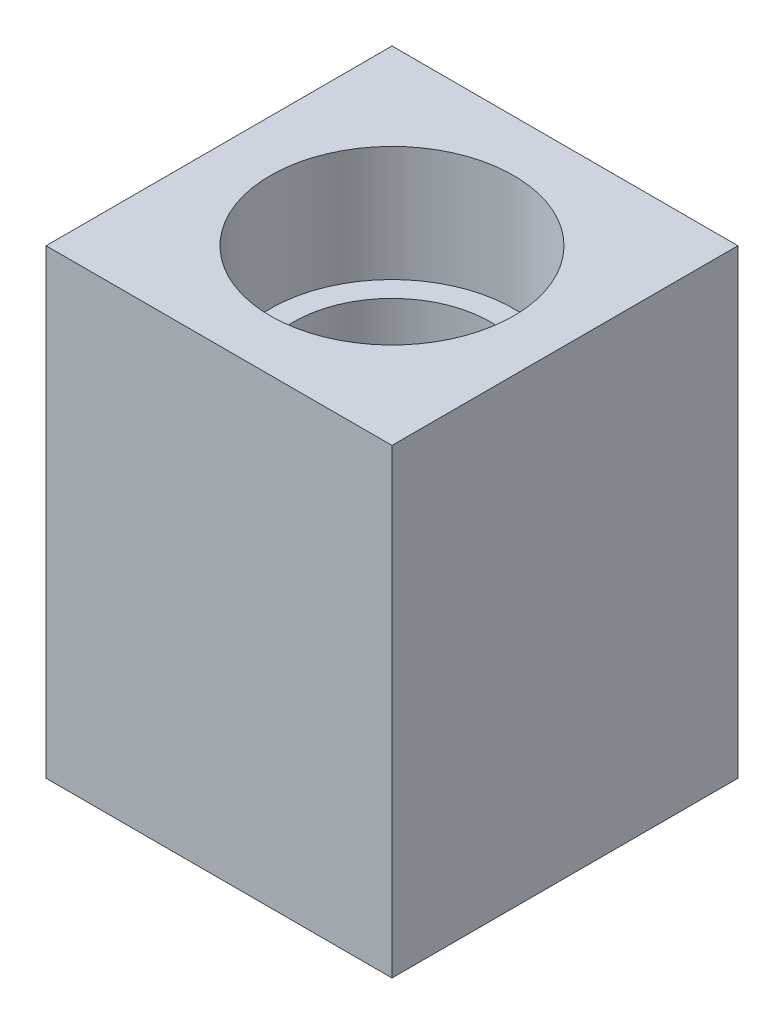
ISO-10303-21;
HEADER;
FILE_DESCRIPTION(('STEP AP214'),'2;1');
FILE_NAME('part.step','',(''),(''),'','','');
FILE_SCHEMA(('AUTOMOTIVE_DESIGN { 1 0 10303 214 1 1 1 1 }'));
ENDSEC;
DATA;
#1=APPLICATION_CONTEXT('core data for automotive mechanical design processes');
#2=APPLICATION_PROTOCOL_DEFINITION('international standard','automotive_design',2000,#1);
#3=PRODUCT_CONTEXT('',#1,'mechanical');
#4=PRODUCT('Part','Part','',(#3));
#5=PRODUCT_RELATED_PRODUCT_CATEGORY('part','',(#4));
#6=PRODUCT_DEFINITION_FORMATION('','',#4);
#7=PRODUCT_DEFINITION_CONTEXT('part definition',#1,'design');
#8=PRODUCT_DEFINITION('design','',#6,#7);
#9=PRODUCT_DEFINITION_SHAPE('','',#8);
#10=(LENGTH_UNIT() NAMED_UNIT(*) SI_UNIT(.MILLI.,.METRE.));
#11=(NAMED_UNIT(*) PLANE_ANGLE_UNIT() SI_UNIT($,.RADIAN.));
#12=(NAMED_UNIT(*) SI_UNIT($,.STERADIAN.) SOLID_ANGLE_UNIT());
#13=UNCERTAINTY_MEASURE_WITH_UNIT(LENGTH_MEASURE(1.E-05),#10,'distance_accuracy_value','');
#14=(GEOMETRIC_REPRESENTATION_CONTEXT(3) GLOBAL_UNCERTAINTY_ASSIGNED_CONTEXT((#13)) GLOBAL_UNIT_ASSIGNED_CONTEXT((#10,
#11,#12)) REPRESENTATION_CONTEXT('',''));
#15=CARTESIAN_POINT('',(0.,0.,0.));
#16=DIRECTION('',(0.,0.,1.));
#17=DIRECTION('',(1.,0.,0.));
#18=AXIS2_PLACEMENT_3D('',#15,#16,#17);
#19=CARTESIAN_POINT('',(0.,0.,0.));
#20=DIRECTION('',(0.,1.,0.));
#21=DIRECTION('',(0.,0.,1.));
#22=AXIS2_PLACEMENT_3D('',#19,#20,#21);
#23=CYLINDRICAL_SURFACE('',#22,4.275);
#24=CARTESIAN_POINT('',(0.,0.,0.));
#25=DIRECTION('',(0.,1.,0.));
#26=DIRECTION('',(0.,0.,1.));
#27=AXIS2_PLACEMENT_3D('',#24,#25,#26);
#28=CIRCLE('',#27,4.275);
#29=CARTESIAN_POINT('',(0.,0.,4.275));
#30=VERTEX_POINT('',#29);
#31=EDGE_CURVE('E118',#30,#30,#28,.T.);
#32=ORIENTED_EDGE('',*,*,#31,.F.);
#33=EDGE_LOOP('',(#32));
#34=FACE_BOUND('',#33,.T.);
#35=CARTESIAN_POINT('',(0.,15.,0.));
#36=DIRECTION('',(0.,1.,0.));
#37=DIRECTION('',(0.,0.,1.));
#38=AXIS2_PLACEMENT_3D('',#35,#36,#37);
#39=CIRCLE('',#38,4.275);
#40=CARTESIAN_POINT('',(0.,15.,4.275));
#41=VERTEX_POINT('',#40);
#42=EDGE_CURVE('E47',#41,#41,#39,.F.);
#43=ORIENTED_EDGE('',*,*,#42,.F.);
#44=EDGE_LOOP('',(#43));
#45=FACE_BOUND('',#44,.T.);
#46=ADVANCED_FACE('F43',(#34,#45),#23,.F.);
#47=CARTESIAN_POINT('',(7.5,20.,7.5));
#48=DIRECTION('',(-1.,0.,0.));
#49=DIRECTION('',(0.,0.,1.));
#50=AXIS2_PLACEMENT_3D('',#47,#48,#49);
#51=PLANE('',#50);
#52=DIRECTION('',(0.,0.,-1.));
#53=VECTOR('',#52,1.);
#54=CARTESIAN_POINT('',(7.5,0.,7.5));
#55=LINE('',#54,#53);
#56=CARTESIAN_POINT('',(7.5,0.,7.5));
#57=VERTEX_POINT('',#56);
#58=CARTESIAN_POINT('',(7.5,0.,-7.5));
#59=VERTEX_POINT('',#58);
#60=EDGE_CURVE('E114',#57,#59,#55,.T.);
#61=ORIENTED_EDGE('',*,*,#60,.T.);
#62=DIRECTION('',(0.,-1.,0.));
#63=VECTOR('',#62,1.);
#64=CARTESIAN_POINT('',(7.5,20.,-7.5));
#65=LINE('',#64,#63);
#66=CARTESIAN_POINT('',(7.5,20.,-7.5));
#67=VERTEX_POINT('',#66);
#68=EDGE_CURVE('E11',#67,#59,#65,.T.);
#69=ORIENTED_EDGE('',*,*,#68,.F.);
#70=DIRECTION('',(0.,0.,-1.));
#71=VECTOR('',#70,1.);
#72=CARTESIAN_POINT('',(7.5,20.,7.5));
#73=LINE('',#72,#71);
#74=CARTESIAN_POINT('',(7.5,20.,7.5));
#75=VERTEX_POINT('',#74);
#76=EDGE_CURVE('E97',#75,#67,#73,.T.);
#77=ORIENTED_EDGE('',*,*,#76,.F.);
#78=DIRECTION('',(0.,-1.,0.));
#79=VECTOR('',#78,1.);
#80=CARTESIAN_POINT('',(7.5,20.,7.5));
#81=LINE('',#80,#79);
#82=EDGE_CURVE('E110',#75,#57,#81,.T.);
#83=ORIENTED_EDGE('',*,*,#82,.T.);
#84=EDGE_LOOP('',(#61,#69,#77,#83));
#85=FACE_BOUND('',#84,.T.);
#86=ADVANCED_FACE('F45',(#85),#51,.F.);
#87=CARTESIAN_POINT('',(-7.5,20.,-7.5));
#88=DIRECTION('',(0.,0.,1.));
#89=DIRECTION('',(1.,0.,0.));
#90=AXIS2_PLACEMENT_3D('',#87,#88,#89);
#91=PLANE('',#90);
#92=DIRECTION('',(-1.,0.,0.));
#93=VECTOR('',#92,1.);
#94=CARTESIAN_POINT('',(-7.5,0.,-7.5));
#95=LINE('',#94,#93);
#96=CARTESIAN_POINT('',(-7.5,0.,-7.5));
#97=VERTEX_POINT('',#96);
#98=EDGE_CURVE('E102',#59,#97,#95,.T.);
#99=ORIENTED_EDGE('',*,*,#98,.T.);
#100=DIRECTION('',(0.,-1.,0.));
#101=VECTOR('',#100,1.);
#102=CARTESIAN_POINT('',(-7.5,20.,-7.5));
#103=LINE('',#102,#101);
#104=CARTESIAN_POINT('',(-7.5,20.,-7.5));
#105=VERTEX_POINT('',#104);
#106=EDGE_CURVE('E54',#105,#97,#103,.T.);
#107=ORIENTED_EDGE('',*,*,#106,.F.);
#108=DIRECTION('',(-1.,0.,0.));
#109=VECTOR('',#108,1.);
#110=CARTESIAN_POINT('',(-7.5,20.,-7.5));
#111=LINE('',#110,#109);
#112=EDGE_CURVE('E92',#67,#105,#111,.T.);
#113=ORIENTED_EDGE('',*,*,#112,.F.);
#114=ORIENTED_EDGE('',*,*,#68,.T.);
#115=EDGE_LOOP('',(#99,#107,#113,#114));
#116=FACE_BOUND('',#115,.T.);
#117=ADVANCED_FACE('F101',(#116),#91,.F.);
#118=CARTESIAN_POINT('',(-7.5,20.,7.5));
#119=DIRECTION('',(1.,0.,0.));
#120=DIRECTION('',(0.,0.,-1.));
#121=AXIS2_PLACEMENT_3D('',#118,#119,#120);
#122=PLANE('',#121);
#123=DIRECTION('',(0.,0.,1.));
#124=VECTOR('',#123,1.);
#125=CARTESIAN_POINT('',(-7.5,0.,7.5));
#126=LINE('',#125,#124);
#127=CARTESIAN_POINT('',(-7.5,0.,7.5));
#128=VERTEX_POINT('',#127);
#129=EDGE_CURVE('E79',#97,#128,#126,.T.);
#130=ORIENTED_EDGE('',*,*,#129,.T.);
#131=DIRECTION('',(0.,-1.,0.));
#132=VECTOR('',#131,1.);
#133=CARTESIAN_POINT('',(-7.5,20.,7.5));
#134=LINE('',#133,#132);
#135=CARTESIAN_POINT('',(-7.5,20.,7.5));
#136=VERTEX_POINT('',#135);
#137=EDGE_CURVE('E104',#136,#128,#134,.T.);
#138=ORIENTED_EDGE('',*,*,#137,.F.);
#139=DIRECTION('',(0.,0.,1.));
#140=VECTOR('',#139,1.);
#141=CARTESIAN_POINT('',(-7.5,20.,7.5));
#142=LINE('',#141,#140);
#143=EDGE_CURVE('E95',#105,#136,#142,.T.);
#144=ORIENTED_EDGE('',*,*,#143,.F.);
#145=ORIENTED_EDGE('',*,*,#106,.T.);
#146=EDGE_LOOP('',(#130,#138,#144,#145));
#147=FACE_BOUND('',#146,.T.);
#148=ADVANCED_FACE('F106',(#147),#122,.F.);
#149=CARTESIAN_POINT('',(-7.5,20.,7.5));
#150=DIRECTION('',(0.,0.,-1.));
#151=DIRECTION('',(-1.,0.,0.));
#152=AXIS2_PLACEMENT_3D('',#149,#150,#151);
#153=PLANE('',#152);
#154=DIRECTION('',(1.,0.,0.));
#155=VECTOR('',#154,1.);
#156=CARTESIAN_POINT('',(-7.5,0.,7.5));
#157=LINE('',#156,#155);
#158=EDGE_CURVE('E85',#128,#57,#157,.T.);
#159=ORIENTED_EDGE('',*,*,#158,.T.);
#160=ORIENTED_EDGE('',*,*,#82,.F.);
#161=DIRECTION('',(1.,0.,0.));
#162=VECTOR('',#161,1.);
#163=CARTESIAN_POINT('',(-7.5,20.,7.5));
#164=LINE('',#163,#162);
#165=EDGE_CURVE('E62',#136,#75,#164,.T.);
#166=ORIENTED_EDGE('',*,*,#165,.F.);
#167=ORIENTED_EDGE('',*,*,#137,.T.);
#168=EDGE_LOOP('',(#159,#160,#166,#167));
#169=FACE_BOUND('',#168,.T.);
#170=ADVANCED_FACE('F128',(#169),#153,.F.);
#171=CARTESIAN_POINT('',(0.,20.,0.));
#172=DIRECTION('',(0.,-1.,0.));
#173=DIRECTION('',(0.,0.,-1.));
#174=AXIS2_PLACEMENT_3D('',#171,#172,#173);
#175=PLANE('',#174);
#176=CARTESIAN_POINT('',(0.,20.,0.));
#177=DIRECTION('',(0.,1.,0.));
#178=DIRECTION('',(0.,0.,1.));
#179=AXIS2_PLACEMENT_3D('',#176,#177,#178);
#180=CIRCLE('',#179,5.275);
#181=CARTESIAN_POINT('',(0.,20.,5.275));
#182=VERTEX_POINT('',#181);
#183=EDGE_CURVE('E138',#182,#182,#180,.T.);
#184=ORIENTED_EDGE('',*,*,#183,.F.);
#185=EDGE_LOOP('',(#184));
#186=FACE_BOUND('',#185,.T.);
#187=ORIENTED_EDGE('',*,*,#76,.T.);
#188=ORIENTED_EDGE('',*,*,#112,.T.);
#189=ORIENTED_EDGE('',*,*,#143,.T.);
#190=ORIENTED_EDGE('',*,*,#165,.T.);
#191=EDGE_LOOP('',(#187,#188,#189,#190));
#192=FACE_BOUND('',#191,.T.);
#193=ADVANCED_FACE('F93',(#186,#192),#175,.F.);
#194=CARTESIAN_POINT('',(0.,0.,0.));
#195=DIRECTION('',(0.,-1.,0.));
#196=DIRECTION('',(0.,0.,-1.));
#197=AXIS2_PLACEMENT_3D('',#194,#195,#196);
#198=PLANE('',#197);
#199=ORIENTED_EDGE('',*,*,#31,.T.);
#200=EDGE_LOOP('',(#199));
#201=FACE_BOUND('',#200,.T.);
#202=ORIENTED_EDGE('',*,*,#60,.F.);
#203=ORIENTED_EDGE('',*,*,#158,.F.);
#204=ORIENTED_EDGE('',*,*,#129,.F.);
#205=ORIENTED_EDGE('',*,*,#98,.F.);
#206=EDGE_LOOP('',(#202,#203,#204,#205));
#207=FACE_BOUND('',#206,.T.);
#208=ADVANCED_FACE('F131',(#201,#207),#198,.T.);
#209=CARTESIAN_POINT('',(0.,15.,0.));
#210=DIRECTION('',(0.,1.,0.));
#211=DIRECTION('',(0.,0.,1.));
#212=AXIS2_PLACEMENT_3D('',#209,#210,#211);
#213=PLANE('',#212);
#214=CARTESIAN_POINT('',(0.,15.,0.));
#215=DIRECTION('',(0.,1.,0.));
#216=DIRECTION('',(0.,0.,1.));
#217=AXIS2_PLACEMENT_3D('',#214,#215,#216);
#218=CIRCLE('',#217,5.275);
#219=CARTESIAN_POINT('',(0.,15.,5.275));
#220=VERTEX_POINT('',#219);
#221=EDGE_CURVE('E142',#220,#220,#218,.T.);
#222=ORIENTED_EDGE('',*,*,#221,.T.);
#223=EDGE_LOOP('',(#222));
#224=FACE_BOUND('',#223,.T.);
#225=ORIENTED_EDGE('',*,*,#42,.T.);
#226=EDGE_LOOP('',(#225));
#227=FACE_BOUND('',#226,.T.);
#228=ADVANCED_FACE('F151',(#224,#227),#213,.T.);
#229=CARTESIAN_POINT('',(0.,15.,0.));
#230=DIRECTION('',(0.,1.,0.));
#231=DIRECTION('',(0.,0.,1.));
#232=AXIS2_PLACEMENT_3D('',#229,#230,#231);
#233=CYLINDRICAL_SURFACE('',#232,5.275);
#234=ORIENTED_EDGE('',*,*,#221,.F.);
#235=EDGE_LOOP('',(#234));
#236=FACE_BOUND('',#235,.T.);
#237=ORIENTED_EDGE('',*,*,#183,.T.);
#238=EDGE_LOOP('',(#237));
#239=FACE_BOUND('',#238,.T.);
#240=ADVANCED_FACE('F162',(#236,#239),#233,.F.);
#241=CLOSED_SHELL('',(#46,#86,#117,#148,#170,#193,#208,#228,#240));
#242=MANIFOLD_SOLID_BREP('B2',#241);
#243=ADVANCED_BREP_SHAPE_REPRESENTATION('',(#18,#242),#14);
#244=SHAPE_DEFINITION_REPRESENTATION(#9,#243);
ENDSEC;
END-ISO-10303-21;
